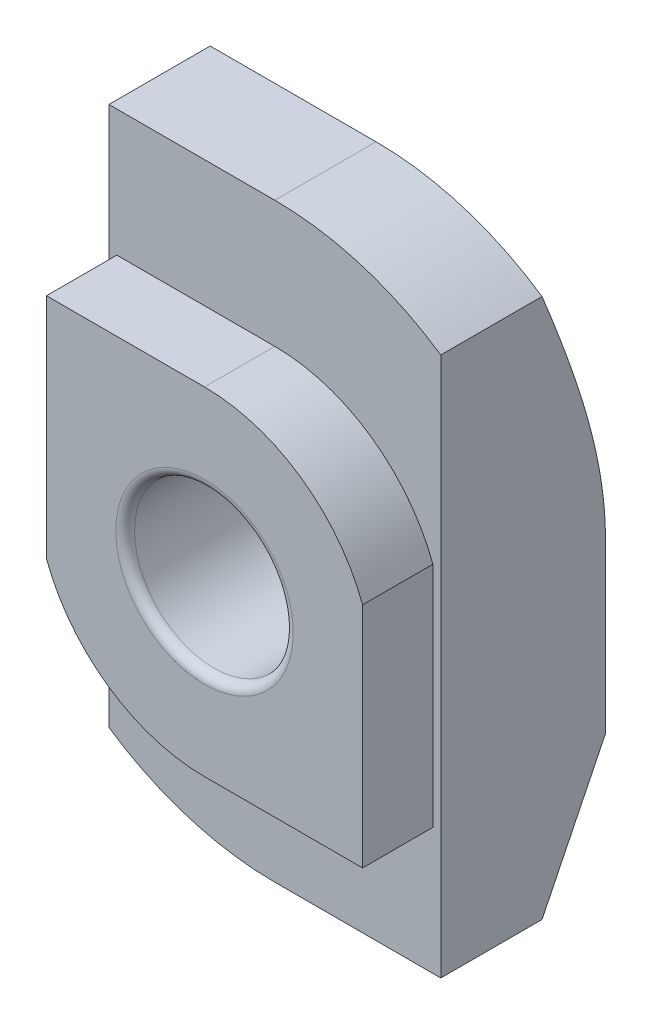
ISO-10303-21;
HEADER;
FILE_DESCRIPTION(('STEP AP214'),'2;1');
FILE_NAME('part.step','',(''),(''),'','','');
FILE_SCHEMA(('AUTOMOTIVE_DESIGN { 1 0 10303 214 1 1 1 1 }'));
ENDSEC;
DATA;
#1=APPLICATION_CONTEXT('core data for automotive mechanical design processes');
#2=APPLICATION_PROTOCOL_DEFINITION('international standard','automotive_design',2000,#1);
#3=PRODUCT_CONTEXT('',#1,'mechanical');
#4=PRODUCT('Part','Part','',(#3));
#5=PRODUCT_RELATED_PRODUCT_CATEGORY('part','',(#4));
#6=PRODUCT_DEFINITION_FORMATION('','',#4);
#7=PRODUCT_DEFINITION_CONTEXT('part definition',#1,'design');
#8=PRODUCT_DEFINITION('design','',#6,#7);
#9=PRODUCT_DEFINITION_SHAPE('','',#8);
#10=(LENGTH_UNIT() NAMED_UNIT(*) SI_UNIT(.MILLI.,.METRE.));
#11=(NAMED_UNIT(*) PLANE_ANGLE_UNIT() SI_UNIT($,.RADIAN.));
#12=(NAMED_UNIT(*) SI_UNIT($,.STERADIAN.) SOLID_ANGLE_UNIT());
#13=UNCERTAINTY_MEASURE_WITH_UNIT(LENGTH_MEASURE(1.E-05),#10,'distance_accuracy_value','');
#14=(GEOMETRIC_REPRESENTATION_CONTEXT(3) GLOBAL_UNCERTAINTY_ASSIGNED_CONTEXT((#13)) GLOBAL_UNIT_ASSIGNED_CONTEXT((#10,
#11,#12)) REPRESENTATION_CONTEXT('',''));
#15=CARTESIAN_POINT('',(0.,0.,0.));
#16=DIRECTION('',(0.,0.,1.));
#17=DIRECTION('',(1.,0.,0.));
#18=AXIS2_PLACEMENT_3D('',#15,#16,#17);
#19=CARTESIAN_POINT('',(-1.405,-0.52533322758036,4.4));
#20=DIRECTION('',(0.,0.,-1.));
#21=DIRECTION('',(-1.,0.,0.));
#22=AXIS2_PLACEMENT_3D('',#19,#20,#21);
#23=CYLINDRICAL_SURFACE('',#22,4.5);
#24=DIRECTION('',(0.,0.,-1.));
#25=VECTOR('',#24,1.);
#26=CARTESIAN_POINT('',(-5.62,-2.10133291032144,4.4));
#27=LINE('',#26,#25);
#28=CARTESIAN_POINT('',(-5.62,-2.10133291032144,4.4));
#29=VERTEX_POINT('',#28);
#30=CARTESIAN_POINT('',(-5.62,-2.10133291032144,2.525));
#31=VERTEX_POINT('',#30);
#32=EDGE_CURVE('E174',#29,#31,#27,.T.);
#33=ORIENTED_EDGE('',*,*,#32,.T.);
#34=CARTESIAN_POINT('',(-1.405,-0.52533322758036,2.525));
#35=DIRECTION('',(0.,0.,-1.));
#36=DIRECTION('',(-1.,0.,0.));
#37=AXIS2_PLACEMENT_3D('',#34,#35,#36);
#38=CIRCLE('',#37,4.5);
#39=CARTESIAN_POINT('',(-1.405,-5.02533322758036,2.525));
#40=VERTEX_POINT('',#39);
#41=EDGE_CURVE('E343',#31,#40,#38,.F.);
#42=ORIENTED_EDGE('',*,*,#41,.T.);
#43=DIRECTION('',(0.,0.,-1.));
#44=VECTOR('',#43,1.);
#45=CARTESIAN_POINT('',(-1.405,-5.02533322758036,4.4));
#46=LINE('',#45,#44);
#47=CARTESIAN_POINT('',(-1.405,-5.02533322758036,4.4));
#48=VERTEX_POINT('',#47);
#49=EDGE_CURVE('E185',#48,#40,#46,.T.);
#50=ORIENTED_EDGE('',*,*,#49,.F.);
#51=CARTESIAN_POINT('',(-1.405,-0.52533322758036,4.4));
#52=DIRECTION('',(0.,0.,1.));
#53=DIRECTION('',(-1.,0.,0.));
#54=AXIS2_PLACEMENT_3D('',#51,#52,#53);
#55=CIRCLE('',#54,4.5);
#56=EDGE_CURVE('E189',#29,#48,#55,.T.);
#57=ORIENTED_EDGE('',*,*,#56,.F.);
#58=EDGE_LOOP('',(#33,#42,#50,#57));
#59=FACE_BOUND('',#58,.T.);
#60=ADVANCED_FACE('F38',(#59),#23,.T.);
#61=CARTESIAN_POINT('',(-1.405,3.97466677241964,4.4));
#62=DIRECTION('',(0.,-1.,0.));
#63=DIRECTION('',(0.,0.,-1.));
#64=AXIS2_PLACEMENT_3D('',#61,#62,#63);
#65=PLANE('',#64);
#66=DIRECTION('',(1.,0.,0.));
#67=VECTOR('',#66,1.);
#68=CARTESIAN_POINT('',(-1.405,3.97466677241964,2.525));
#69=LINE('',#68,#67);
#70=CARTESIAN_POINT('',(-5.62,3.97466677241964,2.525));
#71=VERTEX_POINT('',#70);
#72=CARTESIAN_POINT('',(-1.405,3.97466677241964,2.525));
#73=VERTEX_POINT('',#72);
#74=EDGE_CURVE('E345',#71,#73,#69,.T.);
#75=ORIENTED_EDGE('',*,*,#74,.F.);
#76=DIRECTION('',(0.,0.,1.));
#77=VECTOR('',#76,1.);
#78=CARTESIAN_POINT('',(-5.62,3.97466677241964,4.4));
#79=LINE('',#78,#77);
#80=CARTESIAN_POINT('',(-5.62,3.97466677241964,4.4));
#81=VERTEX_POINT('',#80);
#82=EDGE_CURVE('E186',#71,#81,#79,.T.);
#83=ORIENTED_EDGE('',*,*,#82,.T.);
#84=DIRECTION('',(-1.,0.,0.));
#85=VECTOR('',#84,1.);
#86=CARTESIAN_POINT('',(-1.405,3.97466677241964,4.4));
#87=LINE('',#86,#85);
#88=CARTESIAN_POINT('',(-1.405,3.97466677241964,4.4));
#89=VERTEX_POINT('',#88);
#90=EDGE_CURVE('E200',#89,#81,#87,.T.);
#91=ORIENTED_EDGE('',*,*,#90,.F.);
#92=DIRECTION('',(0.,0.,-1.));
#93=VECTOR('',#92,1.);
#94=CARTESIAN_POINT('',(-1.405,3.97466677241964,4.4));
#95=LINE('',#94,#93);
#96=EDGE_CURVE('E223',#89,#73,#95,.T.);
#97=ORIENTED_EDGE('',*,*,#96,.T.);
#98=EDGE_LOOP('',(#75,#83,#91,#97));
#99=FACE_BOUND('',#98,.T.);
#100=ADVANCED_FACE('F397',(#99),#65,.F.);
#101=CARTESIAN_POINT('',(-1.405,-0.52533322758036,4.4));
#102=DIRECTION('',(0.,0.,-1.));
#103=DIRECTION('',(-1.,0.,0.));
#104=AXIS2_PLACEMENT_3D('',#101,#102,#103);
#105=CYLINDRICAL_SURFACE('',#104,4.5);
#106=DIRECTION('',(0.,0.,-1.));
#107=VECTOR('',#106,1.);
#108=CARTESIAN_POINT('',(2.81,1.05066645516072,4.4));
#109=LINE('',#108,#107);
#110=CARTESIAN_POINT('',(2.81,1.05066645516072,4.4));
#111=VERTEX_POINT('',#110);
#112=CARTESIAN_POINT('',(2.81,1.05066645516072,2.525));
#113=VERTEX_POINT('',#112);
#114=EDGE_CURVE('E217',#111,#113,#109,.T.);
#115=ORIENTED_EDGE('',*,*,#114,.T.);
#116=CARTESIAN_POINT('',(-1.405,-0.52533322758036,2.525));
#117=DIRECTION('',(0.,0.,-1.));
#118=DIRECTION('',(-1.,0.,0.));
#119=AXIS2_PLACEMENT_3D('',#116,#117,#118);
#120=CIRCLE('',#119,4.5);
#121=EDGE_CURVE('E346',#113,#73,#120,.F.);
#122=ORIENTED_EDGE('',*,*,#121,.T.);
#123=ORIENTED_EDGE('',*,*,#96,.F.);
#124=CARTESIAN_POINT('',(-1.405,-0.52533322758036,4.4));
#125=DIRECTION('',(0.,0.,1.));
#126=DIRECTION('',(-1.,0.,0.));
#127=AXIS2_PLACEMENT_3D('',#124,#125,#126);
#128=CIRCLE('',#127,4.5);
#129=EDGE_CURVE('E202',#111,#89,#128,.T.);
#130=ORIENTED_EDGE('',*,*,#129,.F.);
#131=EDGE_LOOP('',(#115,#122,#123,#130));
#132=FACE_BOUND('',#131,.T.);
#133=ADVANCED_FACE('F401',(#132),#105,.T.);
#134=CARTESIAN_POINT('',(-1.405,-5.02533322758036,4.4));
#135=DIRECTION('',(0.,1.,0.));
#136=DIRECTION('',(1.,0.,0.));
#137=AXIS2_PLACEMENT_3D('',#134,#135,#136);
#138=PLANE('',#137);
#139=DIRECTION('',(-1.,0.,0.));
#140=VECTOR('',#139,1.);
#141=CARTESIAN_POINT('',(-1.405,-5.02533322758036,2.525));
#142=LINE('',#141,#140);
#143=CARTESIAN_POINT('',(2.81,-5.02533322758036,2.525));
#144=VERTEX_POINT('',#143);
#145=EDGE_CURVE('E340',#144,#40,#142,.T.);
#146=ORIENTED_EDGE('',*,*,#145,.F.);
#147=DIRECTION('',(0.,0.,1.));
#148=VECTOR('',#147,1.);
#149=CARTESIAN_POINT('',(2.81,-5.02533322758036,4.4));
#150=LINE('',#149,#148);
#151=CARTESIAN_POINT('',(2.81,-5.02533322758036,4.4));
#152=VERTEX_POINT('',#151);
#153=EDGE_CURVE('E233',#144,#152,#150,.T.);
#154=ORIENTED_EDGE('',*,*,#153,.T.);
#155=DIRECTION('',(1.,0.,0.));
#156=VECTOR('',#155,1.);
#157=CARTESIAN_POINT('',(-1.405,-5.02533322758036,4.4));
#158=LINE('',#157,#156);
#159=EDGE_CURVE('E194',#48,#152,#158,.T.);
#160=ORIENTED_EDGE('',*,*,#159,.F.);
#161=ORIENTED_EDGE('',*,*,#49,.T.);
#162=EDGE_LOOP('',(#146,#154,#160,#161));
#163=FACE_BOUND('',#162,.T.);
#164=ADVANCED_FACE('F416',(#163),#138,.F.);
#165=CARTESIAN_POINT('',(-5.83,-8.40033322758036,-2.2));
#166=DIRECTION('',(0.,-1.,0.));
#167=DIRECTION('',(0.,0.,-1.));
#168=AXIS2_PLACEMENT_3D('',#165,#166,#167);
#169=PLANE('',#168);
#170=DIRECTION('',(-1.,0.,0.));
#171=VECTOR('',#170,1.);
#172=CARTESIAN_POINT('',(3.02,-8.40033322758036,2.525));
#173=LINE('',#172,#171);
#174=CARTESIAN_POINT('',(3.02,-8.40033322758036,2.525));
#175=VERTEX_POINT('',#174);
#176=CARTESIAN_POINT('',(-1.405,-8.40033322758036,2.525));
#177=VERTEX_POINT('',#176);
#178=EDGE_CURVE('E335',#175,#177,#173,.T.);
#179=ORIENTED_EDGE('',*,*,#178,.T.);
#180=DIRECTION('',(0.,0.,1.));
#181=VECTOR('',#180,1.);
#182=CARTESIAN_POINT('',(-1.405,-8.40033322758036,1.175));
#183=LINE('',#182,#181);
#184=CARTESIAN_POINT('',(-1.405,-8.40033322758036,-0.175));
#185=VERTEX_POINT('',#184);
#186=EDGE_CURVE('E47',#185,#177,#183,.T.);
#187=ORIENTED_EDGE('',*,*,#186,.F.);
#188=DIRECTION('',(-1.,0.,0.));
#189=VECTOR('',#188,1.);
#190=CARTESIAN_POINT('',(-3.6175,-8.40033322758036,-0.175));
#191=LINE('',#190,#189);
#192=CARTESIAN_POINT('',(3.02,-8.40033322758036,-0.175));
#193=VERTEX_POINT('',#192);
#194=EDGE_CURVE('E11',#193,#185,#191,.T.);
#195=ORIENTED_EDGE('',*,*,#194,.F.);
#196=DIRECTION('',(0.,0.,1.));
#197=VECTOR('',#196,1.);
#198=CARTESIAN_POINT('',(3.02,-8.40033322758036,-2.2));
#199=LINE('',#198,#197);
#200=EDGE_CURVE('E255',#193,#175,#199,.T.);
#201=ORIENTED_EDGE('',*,*,#200,.T.);
#202=EDGE_LOOP('',(#179,#187,#195,#201));
#203=FACE_BOUND('',#202,.T.);
#204=ADVANCED_FACE('F378',(#203),#169,.T.);
#205=CARTESIAN_POINT('',(-3.6175,-6.33783322758036,-1.1875));
#206=DIRECTION('',(0.,-0.440673190639415,-0.89766761056177));
#207=DIRECTION('',(0.,-0.89766761056177,0.440673190639415));
#208=AXIS2_PLACEMENT_3D('',#205,#206,#207);
#209=PLANE('',#208);
#210=DIRECTION('',(0.668005245131528,-0.668005245131529,0.327929847610023));
#211=VECTOR('',#210,1.);
#212=CARTESIAN_POINT('',(0.93596197816787,-2.86629520574823,-2.89170957435395));
#213=LINE('',#212,#211);
#214=CARTESIAN_POINT('',(2.34500000252043,-4.27533323012221,-2.19999999939639));
#215=VERTEX_POINT('',#214);
#216=CARTESIAN_POINT('',(3.02,-4.95033322758036,-1.86863636363636));
#217=VERTEX_POINT('',#216);
#218=EDGE_CURVE('E211',#215,#217,#213,.T.);
#219=ORIENTED_EDGE('',*,*,#218,.T.);
#220=DIRECTION('',(0.,-0.89766761056177,0.440673190639415));
#221=VECTOR('',#220,1.);
#222=CARTESIAN_POINT('',(3.02,-6.96856045187445,-0.877870271710176));
#223=LINE('',#222,#221);
#224=EDGE_CURVE('E245',#217,#193,#223,.T.);
#225=ORIENTED_EDGE('',*,*,#224,.T.);
#226=ORIENTED_EDGE('',*,*,#194,.T.);
#227=DIRECTION('',(0.,-0.89766761056177,0.440673190639415));
#228=VECTOR('',#227,1.);
#229=CARTESIAN_POINT('',(-1.405,-6.33783324216942,-1.18749999283809));
#230=LINE('',#229,#228);
#231=CARTESIAN_POINT('',(-1.405,-4.27533322822308,-2.19999999968448));
#232=VERTEX_POINT('',#231);
#233=EDGE_CURVE('E206',#232,#185,#230,.T.);
#234=ORIENTED_EDGE('',*,*,#233,.F.);
#235=DIRECTION('',(1.,0.,0.));
#236=VECTOR('',#235,1.);
#237=CARTESIAN_POINT('',(-3.6175,-4.27533322758036,-2.2));
#238=LINE('',#237,#236);
#239=EDGE_CURVE('E230',#232,#215,#238,.T.);
#240=ORIENTED_EDGE('',*,*,#239,.T.);
#241=EDGE_LOOP('',(#219,#225,#226,#234,#240));
#242=FACE_BOUND('',#241,.T.);
#243=ADVANCED_FACE('F374',(#242),#209,.T.);
#244=CARTESIAN_POINT('',(0.8075,5.28716677241964,-1.1875));
#245=DIRECTION('',(0.,0.440673190639415,-0.89766761056177));
#246=DIRECTION('',(-1.,0.,0.));
#247=AXIS2_PLACEMENT_3D('',#244,#245,#246);
#248=PLANE('',#247);
#249=DIRECTION('',(-0.668005245131529,0.668005245131529,0.327929847610023));
#250=VECTOR('',#249,1.);
#251=CARTESIAN_POINT('',(-3.74596197816787,1.81562875058751,-2.89170957435395));
#252=LINE('',#251,#250);
#253=CARTESIAN_POINT('',(-5.15500000252043,3.22466677496149,-2.19999999939639));
#254=VERTEX_POINT('',#253);
#255=CARTESIAN_POINT('',(-5.83,3.89966677241964,-1.86863636363636));
#256=VERTEX_POINT('',#255);
#257=EDGE_CURVE('E244',#254,#256,#252,.T.);
#258=ORIENTED_EDGE('',*,*,#257,.T.);
#259=DIRECTION('',(0.,0.89766761056177,0.440673190639415));
#260=VECTOR('',#259,1.);
#261=CARTESIAN_POINT('',(-5.83,5.91789399671373,-0.877870271710176));
#262=LINE('',#261,#260);
#263=CARTESIAN_POINT('',(-5.83,7.34966677241964,-0.175));
#264=VERTEX_POINT('',#263);
#265=EDGE_CURVE('E293',#256,#264,#262,.T.);
#266=ORIENTED_EDGE('',*,*,#265,.T.);
#267=DIRECTION('',(1.,0.,0.));
#268=VECTOR('',#267,1.);
#269=CARTESIAN_POINT('',(0.8075,7.34966677241964,-0.175));
#270=LINE('',#269,#268);
#271=CARTESIAN_POINT('',(-1.405,7.34966677241964,-0.175));
#272=VERTEX_POINT('',#271);
#273=EDGE_CURVE('E215',#264,#272,#270,.T.);
#274=ORIENTED_EDGE('',*,*,#273,.T.);
#275=DIRECTION('',(0.,0.89766761056177,0.440673190639415));
#276=VECTOR('',#275,1.);
#277=CARTESIAN_POINT('',(-1.405,5.2871667870087,-1.18749999283809));
#278=LINE('',#277,#276);
#279=CARTESIAN_POINT('',(-1.405,3.22466677306236,-2.19999999968448));
#280=VERTEX_POINT('',#279);
#281=EDGE_CURVE('E219',#280,#272,#278,.T.);
#282=ORIENTED_EDGE('',*,*,#281,.F.);
#283=DIRECTION('',(-1.,0.,0.));
#284=VECTOR('',#283,1.);
#285=CARTESIAN_POINT('',(0.8075,3.22466677241964,-2.2));
#286=LINE('',#285,#284);
#287=EDGE_CURVE('E266',#280,#254,#286,.T.);
#288=ORIENTED_EDGE('',*,*,#287,.T.);
#289=EDGE_LOOP('',(#258,#266,#274,#282,#288));
#290=FACE_BOUND('',#289,.T.);
#291=ADVANCED_FACE('F367',(#290),#248,.T.);
#292=CARTESIAN_POINT('',(-1.405,-0.52533322758036,1.175));
#293=DIRECTION('',(0.,0.,-1.));
#294=DIRECTION('',(0.,-1.,0.));
#295=AXIS2_PLACEMENT_3D('',#292,#293,#294);
#296=CYLINDRICAL_SURFACE('',#295,7.875);
#297=CARTESIAN_POINT('',(-1.405,-0.525333227580361,2.525));
#298=DIRECTION('',(0.,0.,-1.));
#299=DIRECTION('',(-1.,0.,0.));
#300=AXIS2_PLACEMENT_3D('',#297,#298,#299);
#301=CIRCLE('',#300,7.875);
#302=CARTESIAN_POINT('',(-5.83,-7.0395484527629,2.525));
#303=VERTEX_POINT('',#302);
#304=EDGE_CURVE('E318',#177,#303,#301,.T.);
#305=ORIENTED_EDGE('',*,*,#304,.T.);
#306=DIRECTION('',(0.,0.,1.));
#307=VECTOR('',#306,1.);
#308=CARTESIAN_POINT('',(-5.83,-7.0395484527629,1.175));
#309=LINE('',#308,#307);
#310=CARTESIAN_POINT('',(-5.83,-7.0395484527629,-0.175));
#311=VERTEX_POINT('',#310);
#312=EDGE_CURVE('E226',#311,#303,#309,.T.);
#313=ORIENTED_EDGE('',*,*,#312,.F.);
#314=CARTESIAN_POINT('',(-1.405,-0.525333227580361,-0.175));
#315=DIRECTION('',(0.,0.,-1.));
#316=DIRECTION('',(0.,-1.,0.));
#317=AXIS2_PLACEMENT_3D('',#314,#315,#316);
#318=CIRCLE('',#317,7.875);
#319=EDGE_CURVE('E276',#185,#311,#318,.T.);
#320=ORIENTED_EDGE('',*,*,#319,.F.);
#321=ORIENTED_EDGE('',*,*,#186,.T.);
#322=EDGE_LOOP('',(#305,#313,#320,#321));
#323=FACE_BOUND('',#322,.T.);
#324=ADVANCED_FACE('F316',(#323),#296,.T.);
#325=CARTESIAN_POINT('',(-1.405,-0.52533322758036,-1.18749999283809));
#326=DIRECTION('',(0.,0.,1.));
#327=DIRECTION('',(0.,-1.,0.));
#328=AXIS2_PLACEMENT_3D('',#325,#326,#327);
#329=CONICAL_SURFACE('',#328,5.81250001458906,1.11444785823779);
#330=CARTESIAN_POINT('',(-5.83,-0.52533322758036,-1.86863636363636));
#331=CARTESIAN_POINT('',(-5.83,-2.86886187566433,-1.86863636363636));
#332=CARTESIAN_POINT('',(-5.83,-7.0395484527629,-0.175));
#333=(BOUNDED_CURVE() B_SPLINE_CURVE(2,(#330,#331,#332),.UNSPECIFIED.,.F.,
.F.) B_SPLINE_CURVE_WITH_KNOTS((3,3),(0.448718690060841,0.897437380121683),
.UNSPECIFIED.) CURVE() GEOMETRIC_REPRESENTATION_ITEM() RATIONAL_B_SPLINE_CURVE((1.38983050847458,
1.38983050847458,1.)) REPRESENTATION_ITEM(''));
#334=CARTESIAN_POINT('',(-5.83,-0.52533322758036,-1.86863636363636));
#335=VERTEX_POINT('',#334);
#336=EDGE_CURVE('E252',#335,#311,#333,.T.);
#337=ORIENTED_EDGE('',*,*,#336,.F.);
#338=DIRECTION('',(0.89766761056177,0.,-0.440673190639415));
#339=VECTOR('',#338,1.);
#340=CARTESIAN_POINT('',(-9.28,-0.52533322758036,-0.175));
#341=LINE('',#340,#339);
#342=CARTESIAN_POINT('',(-5.15500000064272,-0.52533322758036,-2.19999999968448));
#343=VERTEX_POINT('',#342);
#344=EDGE_CURVE('E221',#335,#343,#341,.T.);
#345=ORIENTED_EDGE('',*,*,#344,.T.);
#346=CARTESIAN_POINT('',(-1.405,-0.52533322758036,-2.2));
#347=DIRECTION('',(0.,0.,-1.));
#348=DIRECTION('',(0.,-1.,0.));
#349=AXIS2_PLACEMENT_3D('',#346,#347,#348);
#350=CIRCLE('',#349,3.75);
#351=EDGE_CURVE('E267',#232,#343,#350,.T.);
#352=ORIENTED_EDGE('',*,*,#351,.F.);
#353=ORIENTED_EDGE('',*,*,#233,.T.);
#354=ORIENTED_EDGE('',*,*,#319,.T.);
#355=EDGE_LOOP('',(#337,#345,#352,#353,#354));
#356=FACE_BOUND('',#355,.T.);
#357=ADVANCED_FACE('F309',(#356),#329,.T.);
#358=CARTESIAN_POINT('',(-1.405,-0.52533322758036,-1.18749999283809));
#359=DIRECTION('',(0.,0.,1.));
#360=DIRECTION('',(0.,1.,0.));
#361=AXIS2_PLACEMENT_3D('',#358,#359,#360);
#362=CONICAL_SURFACE('',#361,5.81250001458906,1.11444785823779);
#363=CARTESIAN_POINT('',(3.02,-0.525333227580361,-1.86863636363636));
#364=CARTESIAN_POINT('',(3.02,1.81819542050359,-1.86863636363636));
#365=CARTESIAN_POINT('',(3.02,5.98888199760218,-0.175));
#366=(BOUNDED_CURVE() B_SPLINE_CURVE(2,(#363,#364,#365),.UNSPECIFIED.,.F.,
.F.) B_SPLINE_CURVE_WITH_KNOTS((3,3),(0.448718690060842,0.897437380121683),
.UNSPECIFIED.) CURVE() GEOMETRIC_REPRESENTATION_ITEM() RATIONAL_B_SPLINE_CURVE((1.38983050847458,
1.38983050847458,1.)) REPRESENTATION_ITEM(''));
#367=CARTESIAN_POINT('',(3.02,-0.525333227580361,-1.86863636363636));
#368=VERTEX_POINT('',#367);
#369=CARTESIAN_POINT('',(3.02,5.98888199760218,-0.175));
#370=VERTEX_POINT('',#369);
#371=EDGE_CURVE('E240',#368,#370,#366,.T.);
#372=ORIENTED_EDGE('',*,*,#371,.F.);
#373=DIRECTION('',(-0.89766761056177,0.,-0.440673190639415));
#374=VECTOR('',#373,1.);
#375=CARTESIAN_POINT('',(6.47,-0.525333227580361,-0.175));
#376=LINE('',#375,#374);
#377=CARTESIAN_POINT('',(2.34500000064272,-0.525333227580361,-2.19999999968448));
#378=VERTEX_POINT('',#377);
#379=EDGE_CURVE('E208',#368,#378,#376,.T.);
#380=ORIENTED_EDGE('',*,*,#379,.T.);
#381=CARTESIAN_POINT('',(-1.405,-0.52533322758036,-2.2));
#382=DIRECTION('',(0.,0.,-1.));
#383=DIRECTION('',(0.,1.,0.));
#384=AXIS2_PLACEMENT_3D('',#381,#382,#383);
#385=CIRCLE('',#384,3.75);
#386=EDGE_CURVE('E250',#280,#378,#385,.T.);
#387=ORIENTED_EDGE('',*,*,#386,.F.);
#388=ORIENTED_EDGE('',*,*,#281,.T.);
#389=CARTESIAN_POINT('',(-1.405,-0.525333227580361,-0.175));
#390=DIRECTION('',(0.,0.,-1.));
#391=DIRECTION('',(0.,1.,0.));
#392=AXIS2_PLACEMENT_3D('',#389,#390,#391);
#393=CIRCLE('',#392,7.875);
#394=EDGE_CURVE('E214',#272,#370,#393,.T.);
#395=ORIENTED_EDGE('',*,*,#394,.T.);
#396=EDGE_LOOP('',(#372,#380,#387,#388,#395));
#397=FACE_BOUND('',#396,.T.);
#398=ADVANCED_FACE('F415',(#397),#362,.T.);
#399=CARTESIAN_POINT('',(-5.83,-0.52533322758036,-1.86863636363636));
#400=DIRECTION('',(0.440673190639415,0.,0.89766761056177));
#401=DIRECTION('',(0.,-1.,0.));
#402=AXIS2_PLACEMENT_3D('',#399,#400,#401);
#403=PLANE('',#402);
#404=ORIENTED_EDGE('',*,*,#257,.F.);
#405=DIRECTION('',(0.,1.,0.));
#406=VECTOR('',#405,1.);
#407=CARTESIAN_POINT('',(-5.155,-0.52533322758036,-2.2));
#408=LINE('',#407,#406);
#409=EDGE_CURVE('E263',#343,#254,#408,.T.);
#410=ORIENTED_EDGE('',*,*,#409,.F.);
#411=ORIENTED_EDGE('',*,*,#344,.F.);
#412=DIRECTION('',(0.,-1.,0.));
#413=VECTOR('',#412,1.);
#414=CARTESIAN_POINT('',(-5.83,3.41216677241964,-1.86863636363636));
#415=LINE('',#414,#413);
#416=EDGE_CURVE('E283',#256,#335,#415,.T.);
#417=ORIENTED_EDGE('',*,*,#416,.F.);
#418=EDGE_LOOP('',(#404,#410,#411,#417));
#419=FACE_BOUND('',#418,.T.);
#420=ADVANCED_FACE('F304',(#419),#403,.F.);
#421=CARTESIAN_POINT('',(3.02,-8.40033322758036,-2.2));
#422=DIRECTION('',(1.,0.,0.));
#423=DIRECTION('',(0.,1.,0.));
#424=AXIS2_PLACEMENT_3D('',#421,#422,#423);
#425=PLANE('',#424);
#426=DIRECTION('',(0.,0.,1.));
#427=VECTOR('',#426,1.);
#428=CARTESIAN_POINT('',(3.02,5.98888199760218,1.175));
#429=LINE('',#428,#427);
#430=CARTESIAN_POINT('',(3.02,5.98888199760218,2.525));
#431=VERTEX_POINT('',#430);
#432=EDGE_CURVE('E212',#370,#431,#429,.T.);
#433=ORIENTED_EDGE('',*,*,#432,.T.);
#434=DIRECTION('',(0.,-1.,0.));
#435=VECTOR('',#434,1.);
#436=CARTESIAN_POINT('',(3.02,-5.19383330689509,2.525));
#437=LINE('',#436,#435);
#438=EDGE_CURVE('E258',#431,#175,#437,.T.);
#439=ORIENTED_EDGE('',*,*,#438,.T.);
#440=ORIENTED_EDGE('',*,*,#200,.F.);
#441=ORIENTED_EDGE('',*,*,#224,.F.);
#442=DIRECTION('',(0.,1.,0.));
#443=VECTOR('',#442,1.);
#444=CARTESIAN_POINT('',(3.02,-4.46283322758036,-1.86863636363636));
#445=LINE('',#444,#443);
#446=EDGE_CURVE('E210',#217,#368,#445,.T.);
#447=ORIENTED_EDGE('',*,*,#446,.T.);
#448=ORIENTED_EDGE('',*,*,#371,.T.);
#449=EDGE_LOOP('',(#433,#439,#440,#441,#447,#448));
#450=FACE_BOUND('',#449,.T.);
#451=ADVANCED_FACE('F380',(#450),#425,.T.);
#452=CARTESIAN_POINT('',(3.02,-0.525333227580361,-1.86863636363636));
#453=DIRECTION('',(-0.440673190639415,0.,0.89766761056177));
#454=DIRECTION('',(0.,1.,0.));
#455=AXIS2_PLACEMENT_3D('',#452,#453,#454);
#456=PLANE('',#455);
#457=ORIENTED_EDGE('',*,*,#218,.F.);
#458=DIRECTION('',(0.,-1.,0.));
#459=VECTOR('',#458,1.);
#460=CARTESIAN_POINT('',(2.345,-0.525333227580361,-2.2));
#461=LINE('',#460,#459);
#462=EDGE_CURVE('E227',#378,#215,#461,.T.);
#463=ORIENTED_EDGE('',*,*,#462,.F.);
#464=ORIENTED_EDGE('',*,*,#379,.F.);
#465=ORIENTED_EDGE('',*,*,#446,.F.);
#466=EDGE_LOOP('',(#457,#463,#464,#465));
#467=FACE_BOUND('',#466,.T.);
#468=ADVANCED_FACE('F406',(#467),#456,.F.);
#469=CARTESIAN_POINT('',(-5.62,3.97466677241964,4.4));
#470=DIRECTION('',(1.,0.,0.));
#471=DIRECTION('',(0.,1.,0.));
#472=AXIS2_PLACEMENT_3D('',#469,#470,#471);
#473=PLANE('',#472);
#474=DIRECTION('',(0.,-1.,0.));
#475=VECTOR('',#474,1.);
#476=CARTESIAN_POINT('',(-5.62,1.72466677241964,4.4));
#477=LINE('',#476,#475);
#478=EDGE_CURVE('E179',#81,#29,#477,.T.);
#479=ORIENTED_EDGE('',*,*,#478,.F.);
#480=ORIENTED_EDGE('',*,*,#82,.F.);
#481=DIRECTION('',(0.,-1.,0.));
#482=VECTOR('',#481,1.);
#483=CARTESIAN_POINT('',(-5.62,-5.02533322758036,2.525));
#484=LINE('',#483,#482);
#485=EDGE_CURVE('E182',#71,#31,#484,.T.);
#486=ORIENTED_EDGE('',*,*,#485,.T.);
#487=ORIENTED_EDGE('',*,*,#32,.F.);
#488=EDGE_LOOP('',(#479,#480,#486,#487));
#489=FACE_BOUND('',#488,.T.);
#490=ADVANCED_FACE('F176',(#489),#473,.F.);
#491=CARTESIAN_POINT('',(2.81,-5.02533322758036,4.4));
#492=DIRECTION('',(-1.,0.,0.));
#493=DIRECTION('',(0.,0.,1.));
#494=AXIS2_PLACEMENT_3D('',#491,#492,#493);
#495=PLANE('',#494);
#496=DIRECTION('',(0.,1.,0.));
#497=VECTOR('',#496,1.);
#498=CARTESIAN_POINT('',(2.81,-2.77533322758036,4.4));
#499=LINE('',#498,#497);
#500=EDGE_CURVE('E261',#152,#111,#499,.T.);
#501=ORIENTED_EDGE('',*,*,#500,.F.);
#502=ORIENTED_EDGE('',*,*,#153,.F.);
#503=DIRECTION('',(0.,1.,0.));
#504=VECTOR('',#503,1.);
#505=CARTESIAN_POINT('',(2.81,3.97466677241964,2.525));
#506=LINE('',#505,#504);
#507=EDGE_CURVE('E239',#144,#113,#506,.T.);
#508=ORIENTED_EDGE('',*,*,#507,.T.);
#509=ORIENTED_EDGE('',*,*,#114,.F.);
#510=EDGE_LOOP('',(#501,#502,#508,#509));
#511=FACE_BOUND('',#510,.T.);
#512=ADVANCED_FACE('F40',(#511),#495,.F.);
#513=CARTESIAN_POINT('',(-1.405,-0.52533322758036,1.175));
#514=DIRECTION('',(0.,0.,-1.));
#515=DIRECTION('',(0.,1.,0.));
#516=AXIS2_PLACEMENT_3D('',#513,#514,#515);
#517=CYLINDRICAL_SURFACE('',#516,7.875);
#518=CARTESIAN_POINT('',(-1.405,-0.525333227580361,2.525));
#519=DIRECTION('',(0.,0.,-1.));
#520=DIRECTION('',(-1.,0.,0.));
#521=AXIS2_PLACEMENT_3D('',#518,#519,#520);
#522=CIRCLE('',#521,7.875);
#523=CARTESIAN_POINT('',(-1.405,7.34966677241964,2.525));
#524=VERTEX_POINT('',#523);
#525=EDGE_CURVE('E331',#524,#431,#522,.T.);
#526=ORIENTED_EDGE('',*,*,#525,.T.);
#527=ORIENTED_EDGE('',*,*,#432,.F.);
#528=ORIENTED_EDGE('',*,*,#394,.F.);
#529=DIRECTION('',(0.,0.,1.));
#530=VECTOR('',#529,1.);
#531=CARTESIAN_POINT('',(-1.405,7.34966677241964,1.175));
#532=LINE('',#531,#530);
#533=EDGE_CURVE('E224',#272,#524,#532,.T.);
#534=ORIENTED_EDGE('',*,*,#533,.T.);
#535=EDGE_LOOP('',(#526,#527,#528,#534));
#536=FACE_BOUND('',#535,.T.);
#537=ADVANCED_FACE('F384',(#536),#517,.T.);
#538=CARTESIAN_POINT('',(3.02,7.34966677241964,-2.2));
#539=DIRECTION('',(0.,1.,0.));
#540=DIRECTION('',(1.,0.,0.));
#541=AXIS2_PLACEMENT_3D('',#538,#539,#540);
#542=PLANE('',#541);
#543=DIRECTION('',(1.,0.,0.));
#544=VECTOR('',#543,1.);
#545=CARTESIAN_POINT('',(-5.83,7.34966677241964,2.525));
#546=LINE('',#545,#544);
#547=CARTESIAN_POINT('',(-5.83,7.34966677241964,2.525));
#548=VERTEX_POINT('',#547);
#549=EDGE_CURVE('E328',#548,#524,#546,.T.);
#550=ORIENTED_EDGE('',*,*,#549,.T.);
#551=ORIENTED_EDGE('',*,*,#533,.F.);
#552=ORIENTED_EDGE('',*,*,#273,.F.);
#553=DIRECTION('',(0.,0.,1.));
#554=VECTOR('',#553,1.);
#555=CARTESIAN_POINT('',(-5.83,7.34966677241964,-2.2));
#556=LINE('',#555,#554);
#557=EDGE_CURVE('E295',#264,#548,#556,.T.);
#558=ORIENTED_EDGE('',*,*,#557,.T.);
#559=EDGE_LOOP('',(#550,#551,#552,#558));
#560=FACE_BOUND('',#559,.T.);
#561=ADVANCED_FACE('F385',(#560),#542,.T.);
#562=CARTESIAN_POINT('',(-5.83,7.34966677241964,-2.2));
#563=DIRECTION('',(-1.,0.,0.));
#564=DIRECTION('',(0.,0.,1.));
#565=AXIS2_PLACEMENT_3D('',#562,#563,#564);
#566=PLANE('',#565);
#567=ORIENTED_EDGE('',*,*,#312,.T.);
#568=DIRECTION('',(0.,1.,0.));
#569=VECTOR('',#568,1.);
#570=CARTESIAN_POINT('',(-5.83,4.14316685173437,2.525));
#571=LINE('',#570,#569);
#572=EDGE_CURVE('E236',#303,#548,#571,.T.);
#573=ORIENTED_EDGE('',*,*,#572,.T.);
#574=ORIENTED_EDGE('',*,*,#557,.F.);
#575=ORIENTED_EDGE('',*,*,#265,.F.);
#576=ORIENTED_EDGE('',*,*,#416,.T.);
#577=ORIENTED_EDGE('',*,*,#336,.T.);
#578=EDGE_LOOP('',(#567,#573,#574,#575,#576,#577));
#579=FACE_BOUND('',#578,.T.);
#580=ADVANCED_FACE('F300',(#579),#566,.T.);
#581=CARTESIAN_POINT('',(-1.405,-0.52533322758036,2.525));
#582=DIRECTION('',(0.,0.,1.));
#583=DIRECTION('',(1.,0.,0.));
#584=AXIS2_PLACEMENT_3D('',#581,#582,#583);
#585=PLANE('',#584);
#586=ORIENTED_EDGE('',*,*,#549,.F.);
#587=ORIENTED_EDGE('',*,*,#572,.F.);
#588=ORIENTED_EDGE('',*,*,#304,.F.);
#589=ORIENTED_EDGE('',*,*,#178,.F.);
#590=ORIENTED_EDGE('',*,*,#438,.F.);
#591=ORIENTED_EDGE('',*,*,#525,.F.);
#592=EDGE_LOOP('',(#586,#587,#588,#589,#590,#591));
#593=FACE_BOUND('',#592,.T.);
#594=ORIENTED_EDGE('',*,*,#485,.F.);
#595=ORIENTED_EDGE('',*,*,#74,.T.);
#596=ORIENTED_EDGE('',*,*,#121,.F.);
#597=ORIENTED_EDGE('',*,*,#507,.F.);
#598=ORIENTED_EDGE('',*,*,#145,.T.);
#599=ORIENTED_EDGE('',*,*,#41,.F.);
#600=EDGE_LOOP('',(#594,#595,#596,#597,#598,#599));
#601=FACE_BOUND('',#600,.T.);
#602=ADVANCED_FACE('F322',(#593,#601),#585,.T.);
#603=CARTESIAN_POINT('',(-1.405,-0.52533322758036,-2.2));
#604=DIRECTION('',(0.,0.,1.));
#605=DIRECTION('',(1.,0.,0.));
#606=AXIS2_PLACEMENT_3D('',#603,#604,#605);
#607=PLANE('',#606);
#608=CARTESIAN_POINT('',(-1.405,-0.52533322758036,-2.2));
#609=DIRECTION('',(0.,0.,1.));
#610=DIRECTION('',(-1.,0.,0.));
#611=AXIS2_PLACEMENT_3D('',#608,#609,#610);
#612=CIRCLE('',#611,2.117);
#613=CARTESIAN_POINT('',(0.712,-0.52533322758036,-2.2));
#614=VERTEX_POINT('',#613);
#615=EDGE_CURVE('E231',#614,#614,#612,.T.);
#616=ORIENTED_EDGE('',*,*,#615,.T.);
#617=EDGE_LOOP('',(#616));
#618=FACE_BOUND('',#617,.T.);
#619=ORIENTED_EDGE('',*,*,#462,.T.);
#620=ORIENTED_EDGE('',*,*,#239,.F.);
#621=ORIENTED_EDGE('',*,*,#351,.T.);
#622=ORIENTED_EDGE('',*,*,#409,.T.);
#623=ORIENTED_EDGE('',*,*,#287,.F.);
#624=ORIENTED_EDGE('',*,*,#386,.T.);
#625=EDGE_LOOP('',(#619,#620,#621,#622,#623,#624));
#626=FACE_BOUND('',#625,.T.);
#627=ADVANCED_FACE('F370',(#618,#626),#607,.F.);
#628=CARTESIAN_POINT('',(-1.405,-0.52533322758036,4.4));
#629=DIRECTION('',(0.,0.,-1.));
#630=DIRECTION('',(-1.,0.,0.));
#631=AXIS2_PLACEMENT_3D('',#628,#629,#630);
#632=CYLINDRICAL_SURFACE('',#631,2.117);
#633=DIRECTION('',(0.,0.,-1.));
#634=VECTOR('',#633,1.);
#635=CARTESIAN_POINT('',(0.712,-0.52533322758036,4.4));
#636=LINE('',#635,#634);
#637=CARTESIAN_POINT('',(0.712,-0.52533322758036,2.));
#638=VERTEX_POINT('',#637);
#639=EDGE_CURVE('E54',#638,#614,#636,.T.);
#640=ORIENTED_EDGE('',*,*,#639,.F.);
#641=ORIENTED_EDGE('',*,*,#639,.T.);
#642=ORIENTED_EDGE('',*,*,#615,.F.);
#643=EDGE_LOOP('',(#640,#641,#642));
#644=FACE_BOUND('',#643,.T.);
#645=CARTESIAN_POINT('',(0.712,-0.52533322758036,4.15));
#646=VERTEX_POINT('',#645);
#647=CARTESIAN_POINT('',(0.712,-0.52533322758036,2.525));
#648=VERTEX_POINT('',#647);
#649=EDGE_CURVE('E60',#646,#648,#636,.T.);
#650=ORIENTED_EDGE('',*,*,#649,.T.);
#651=ORIENTED_EDGE('',*,*,#649,.F.);
#652=CARTESIAN_POINT('',(-1.405,-0.52533322758036,4.15));
#653=DIRECTION('',(0.,0.,-1.));
#654=DIRECTION('',(-1.,0.,0.));
#655=AXIS2_PLACEMENT_3D('',#652,#653,#654);
#656=CIRCLE('',#655,2.117);
#657=CARTESIAN_POINT('',(-3.522,-0.52533322758036,4.15));
#658=VERTEX_POINT('',#657);
#659=EDGE_CURVE('E42',#658,#646,#656,.T.);
#660=ORIENTED_EDGE('',*,*,#659,.F.);
#661=CARTESIAN_POINT('',(-1.405,-0.52533322758036,4.15));
#662=DIRECTION('',(0.,0.,-1.));
#663=DIRECTION('',(-1.,0.,0.));
#664=AXIS2_PLACEMENT_3D('',#661,#662,#663);
#665=CIRCLE('',#664,2.117);
#666=EDGE_CURVE('E273',#646,#658,#665,.T.);
#667=ORIENTED_EDGE('',*,*,#666,.F.);
#668=EDGE_LOOP('',(#650,#651,#660,#667));
#669=FACE_BOUND('',#668,.T.);
#670=ADVANCED_FACE('F407',(#644,#669),#632,.F.);
#671=CARTESIAN_POINT('',(-1.405,-0.52533322758036,4.4));
#672=DIRECTION('',(0.,0.,1.));
#673=DIRECTION('',(1.,0.,0.));
#674=AXIS2_PLACEMENT_3D('',#671,#672,#673);
#675=PLANE('',#674);
#676=CARTESIAN_POINT('',(-1.405,-0.52533322758036,4.4));
#677=DIRECTION('',(0.,0.,1.));
#678=DIRECTION('',(-1.,0.,0.));
#679=AXIS2_PLACEMENT_3D('',#676,#677,#678);
#680=CIRCLE('',#679,2.367);
#681=CARTESIAN_POINT('',(-3.772,-0.52533322758036,4.4));
#682=VERTEX_POINT('',#681);
#683=EDGE_CURVE('E272',#682,#682,#680,.T.);
#684=ORIENTED_EDGE('',*,*,#683,.F.);
#685=EDGE_LOOP('',(#684));
#686=FACE_BOUND('',#685,.T.);
#687=ORIENTED_EDGE('',*,*,#500,.T.);
#688=ORIENTED_EDGE('',*,*,#129,.T.);
#689=ORIENTED_EDGE('',*,*,#90,.T.);
#690=ORIENTED_EDGE('',*,*,#478,.T.);
#691=ORIENTED_EDGE('',*,*,#56,.T.);
#692=ORIENTED_EDGE('',*,*,#159,.T.);
#693=EDGE_LOOP('',(#687,#688,#689,#690,#691,#692));
#694=FACE_BOUND('',#693,.T.);
#695=ADVANCED_FACE('F197',(#686,#694),#675,.T.);
#696=CARTESIAN_POINT('',(-1.405,-0.52533322758036,4.15));
#697=DIRECTION('',(0.,0.,1.));
#698=DIRECTION('',(1.,0.,0.));
#699=AXIS2_PLACEMENT_3D('',#696,#697,#698);
#700=TOROIDAL_SURFACE('',#699,2.367,0.25);
#701=ORIENTED_EDGE('',*,*,#666,.T.);
#702=CARTESIAN_POINT('',(-3.772,-0.52533322758036,4.15));
#703=DIRECTION('',(0.,-1.,0.));
#704=DIRECTION('',(-1.,0.,0.));
#705=AXIS2_PLACEMENT_3D('',#702,#703,#704);
#706=CIRCLE('',#705,0.25);
#707=EDGE_CURVE('E269',#658,#682,#706,.T.);
#708=ORIENTED_EDGE('',*,*,#707,.T.);
#709=ORIENTED_EDGE('',*,*,#683,.T.);
#710=ORIENTED_EDGE('',*,*,#707,.F.);
#711=ORIENTED_EDGE('',*,*,#659,.T.);
#712=EDGE_LOOP('',(#701,#708,#709,#710,#711));
#713=FACE_BOUND('',#712,.T.);
#714=ADVANCED_FACE('F431',(#713),#700,.T.);
#715=CLOSED_SHELL('',(#60,#100,#133,#164,#204,#243,#291,#324,#357,#398,#420,#451,#468,#490,#512,
#537,#561,#580,#602,#627,#670,#695,#714));
#716=MANIFOLD_SOLID_BREP('B2',#715);
#717=ADVANCED_BREP_SHAPE_REPRESENTATION('',(#18,#716),#14);
#718=SHAPE_DEFINITION_REPRESENTATION(#9,#717);
ENDSEC;
END-ISO-10303-21;
